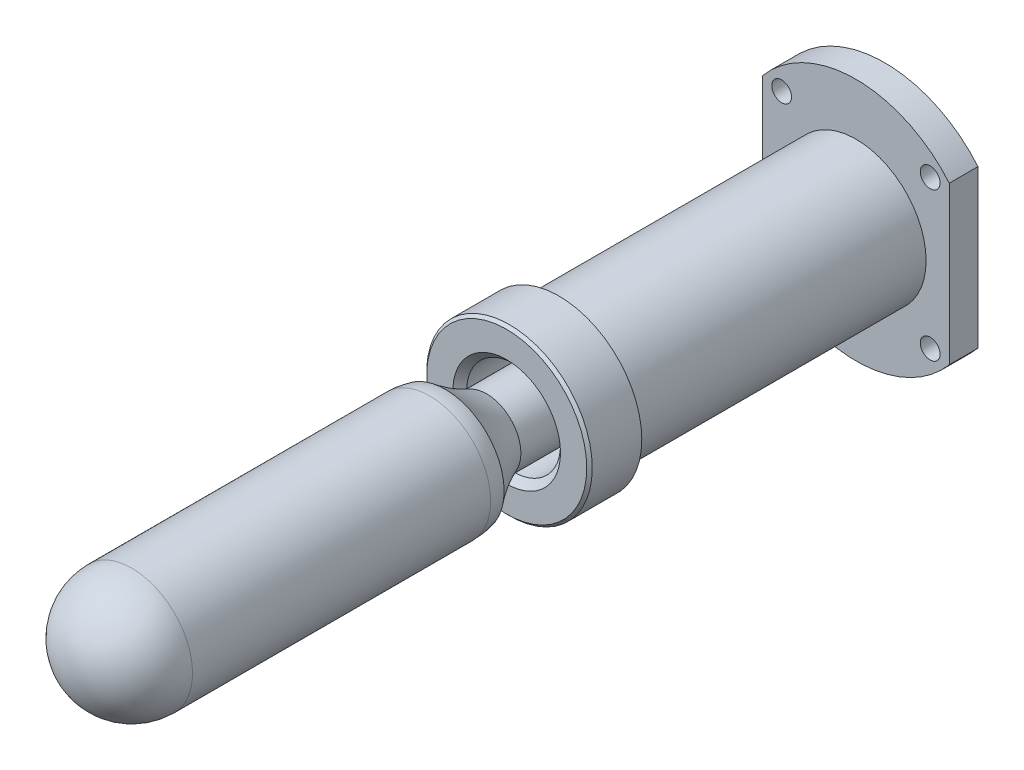
ISO-10303-21;
HEADER;
FILE_DESCRIPTION(('STEP AP214'),'2;1');
FILE_NAME('part.step','',(''),(''),'','','');
FILE_SCHEMA(('AUTOMOTIVE_DESIGN { 1 0 10303 214 1 1 1 1 }'));
ENDSEC;
DATA;
#1=APPLICATION_CONTEXT('core data for automotive mechanical design processes');
#2=APPLICATION_PROTOCOL_DEFINITION('international standard','automotive_design',2000,#1);
#3=PRODUCT_CONTEXT('',#1,'mechanical');
#4=PRODUCT('Part','Part','',(#3));
#5=PRODUCT_RELATED_PRODUCT_CATEGORY('part','',(#4));
#6=PRODUCT_DEFINITION_FORMATION('','',#4);
#7=PRODUCT_DEFINITION_CONTEXT('part definition',#1,'design');
#8=PRODUCT_DEFINITION('design','',#6,#7);
#9=PRODUCT_DEFINITION_SHAPE('','',#8);
#10=(LENGTH_UNIT() NAMED_UNIT(*) SI_UNIT(.MILLI.,.METRE.));
#11=(NAMED_UNIT(*) PLANE_ANGLE_UNIT() SI_UNIT($,.RADIAN.));
#12=(NAMED_UNIT(*) SI_UNIT($,.STERADIAN.) SOLID_ANGLE_UNIT());
#13=UNCERTAINTY_MEASURE_WITH_UNIT(LENGTH_MEASURE(1.E-05),#10,'distance_accuracy_value','');
#14=(GEOMETRIC_REPRESENTATION_CONTEXT(3) GLOBAL_UNCERTAINTY_ASSIGNED_CONTEXT((#13)) GLOBAL_UNIT_ASSIGNED_CONTEXT((#10,
#11,#12)) REPRESENTATION_CONTEXT('',''));
#15=CARTESIAN_POINT('',(0.,0.,0.));
#16=DIRECTION('',(0.,0.,1.));
#17=DIRECTION('',(1.,0.,0.));
#18=AXIS2_PLACEMENT_3D('',#15,#16,#17);
#19=CARTESIAN_POINT('',(-23.9,0.,61.0762435632128));
#20=DIRECTION('',(0.,0.,-1.));
#21=DIRECTION('',(-1.,0.,0.));
#22=AXIS2_PLACEMENT_3D('',#19,#20,#21);
#23=TOROIDAL_SURFACE('',#22,4.22247973708559,2.00000000000001);
#24=CARTESIAN_POINT('',(-23.9,0.,61.0762435632128));
#25=DIRECTION('',(0.,0.,-1.));
#26=DIRECTION('',(-1.,0.,0.));
#27=AXIS2_PLACEMENT_3D('',#24,#25,#26);
#28=CIRCLE('',#27,6.2224797370856);
#29=CARTESIAN_POINT('',(-30.1224797370856,0.,61.0762435632128));
#30=VERTEX_POINT('',#29);
#31=EDGE_CURVE('E131',#30,#30,#28,.T.);
#32=ORIENTED_EDGE('',*,*,#31,.T.);
#33=EDGE_LOOP('',(#32));
#34=FACE_BOUND('',#33,.T.);
#35=CARTESIAN_POINT('',(-23.9,0.,59.0762435632128));
#36=DIRECTION('',(0.,0.,-1.));
#37=DIRECTION('',(-1.,0.,0.));
#38=AXIS2_PLACEMENT_3D('',#35,#36,#37);
#39=CIRCLE('',#38,4.22247973708559);
#40=CARTESIAN_POINT('',(-28.1224797370856,0.,59.0762435632128));
#41=VERTEX_POINT('',#40);
#42=EDGE_CURVE('E12',#41,#41,#39,.T.);
#43=ORIENTED_EDGE('',*,*,#42,.F.);
#44=EDGE_LOOP('',(#43));
#45=FACE_BOUND('',#44,.T.);
#46=ADVANCED_FACE('F109',(#34,#45),#23,.T.);
#47=CARTESIAN_POINT('',(-28.1224797370856,0.,59.0762435632128));
#48=DIRECTION('',(0.,0.,-1.));
#49=DIRECTION('',(-1.,0.,0.));
#50=AXIS2_PLACEMENT_3D('',#47,#48,#49);
#51=PLANE('',#50);
#52=ORIENTED_EDGE('',*,*,#42,.T.);
#53=EDGE_LOOP('',(#52));
#54=FACE_BOUND('',#53,.T.);
#55=ADVANCED_FACE('F156',(#54),#51,.T.);
#56=CARTESIAN_POINT('',(-23.9,0.,136.377543419898));
#57=DIRECTION('',(0.,0.,-1.));
#58=DIRECTION('',(-1.,0.,0.));
#59=AXIS2_PLACEMENT_3D('',#56,#57,#58);
#60=SPHERICAL_SURFACE('',#59,11.);
#61=CARTESIAN_POINT('',(-23.9,0.,136.377543419898));
#62=DIRECTION('',(0.,0.,-1.));
#63=DIRECTION('',(-1.,0.,0.));
#64=AXIS2_PLACEMENT_3D('',#61,#62,#63);
#65=CIRCLE('',#64,11.);
#66=CARTESIAN_POINT('',(-34.9,0.,136.377543419898));
#67=VERTEX_POINT('',#66);
#68=EDGE_CURVE('E115',#67,#67,#65,.T.);
#69=ORIENTED_EDGE('',*,*,#68,.F.);
#70=EDGE_LOOP('',(#69));
#71=FACE_BOUND('',#70,.T.);
#72=ADVANCED_FACE('F154',(#71),#60,.T.);
#73=CARTESIAN_POINT('',(-23.9,0.,59.0762435632128));
#74=DIRECTION('',(0.,0.,-1.));
#75=DIRECTION('',(-1.,0.,0.));
#76=AXIS2_PLACEMENT_3D('',#73,#74,#75);
#77=CYLINDRICAL_SURFACE('',#76,11.);
#78=ORIENTED_EDGE('',*,*,#68,.T.);
#79=EDGE_LOOP('',(#78));
#80=FACE_BOUND('',#79,.T.);
#81=CARTESIAN_POINT('',(-23.9,0.,82.3775434198977));
#82=DIRECTION('',(0.,0.,-1.));
#83=DIRECTION('',(-1.,0.,0.));
#84=AXIS2_PLACEMENT_3D('',#81,#82,#83);
#85=CIRCLE('',#84,11.);
#86=CARTESIAN_POINT('',(-34.9,0.,82.3775434198977));
#87=VERTEX_POINT('',#86);
#88=EDGE_CURVE('E119',#87,#87,#85,.T.);
#89=ORIENTED_EDGE('',*,*,#88,.F.);
#90=EDGE_LOOP('',(#89));
#91=FACE_BOUND('',#90,.T.);
#92=ADVANCED_FACE('F150',(#80,#91),#77,.T.);
#93=CARTESIAN_POINT('',(-23.9,0.,82.3775434198977));
#94=DIRECTION('',(0.,0.,-1.));
#95=DIRECTION('',(-1.,0.,0.));
#96=AXIS2_PLACEMENT_3D('',#93,#94,#95);
#97=SPHERICAL_SURFACE('',#96,11.);
#98=ORIENTED_EDGE('',*,*,#88,.T.);
#99=EDGE_LOOP('',(#98));
#100=FACE_BOUND('',#99,.T.);
#101=CARTESIAN_POINT('',(-23.9,0.,79.5762435632129));
#102=DIRECTION('',(0.,0.,-1.));
#103=DIRECTION('',(-1.,0.,0.));
#104=AXIS2_PLACEMENT_3D('',#101,#102,#103);
#105=CIRCLE('',#104,10.6373266901481);
#106=CARTESIAN_POINT('',(-34.5373266901481,0.,79.5762435632129));
#107=VERTEX_POINT('',#106);
#108=EDGE_CURVE('E123',#107,#107,#105,.T.);
#109=ORIENTED_EDGE('',*,*,#108,.F.);
#110=EDGE_LOOP('',(#109));
#111=FACE_BOUND('',#110,.T.);
#112=ADVANCED_FACE('F146',(#100,#111),#97,.T.);
#113=CARTESIAN_POINT('',(-30.1224797370856,0.,72.1224314730056));
#114=CARTESIAN_POINT('',(-31.7959778925157,0.,76.1482283671684));
#115=CARTESIAN_POINT('',(-34.5373266901481,0.,79.5762435632129));
#116=B_SPLINE_CURVE_WITH_KNOTS('',2,(#113,#114,#115),.UNSPECIFIED.,.F.,.F.,(3,3),(0.,1.),.UNSPECIFIED.);
#117=CARTESIAN_POINT('',(-23.9,0.,59.0762435632128));
#118=DIRECTION('',(0.,0.,-1.));
#119=AXIS1_PLACEMENT('',#117,#118);
#120=SURFACE_OF_REVOLUTION('',#116,#119);
#121=ORIENTED_EDGE('',*,*,#108,.T.);
#122=EDGE_LOOP('',(#121));
#123=FACE_BOUND('',#122,.T.);
#124=CARTESIAN_POINT('',(-23.9,0.,72.1224314730056));
#125=DIRECTION('',(0.,0.,-1.));
#126=DIRECTION('',(-1.,0.,0.));
#127=AXIS2_PLACEMENT_3D('',#124,#125,#126);
#128=CIRCLE('',#127,6.2224797370856);
#129=CARTESIAN_POINT('',(-30.1224797370856,0.,72.1224314730056));
#130=VERTEX_POINT('',#129);
#131=EDGE_CURVE('E128',#130,#130,#128,.T.);
#132=ORIENTED_EDGE('',*,*,#131,.F.);
#133=EDGE_LOOP('',(#132));
#134=FACE_BOUND('',#133,.T.);
#135=ADVANCED_FACE('F141',(#123,#134),#120,.F.);
#136=CARTESIAN_POINT('',(-23.9,0.,59.0762435632128));
#137=DIRECTION('',(0.,0.,-1.));
#138=DIRECTION('',(-1.,0.,0.));
#139=AXIS2_PLACEMENT_3D('',#136,#137,#138);
#140=CYLINDRICAL_SURFACE('',#139,6.2224797370856);
#141=ORIENTED_EDGE('',*,*,#131,.T.);
#142=EDGE_LOOP('',(#141));
#143=FACE_BOUND('',#142,.T.);
#144=ORIENTED_EDGE('',*,*,#31,.F.);
#145=EDGE_LOOP('',(#144));
#146=FACE_BOUND('',#145,.T.);
#147=ADVANCED_FACE('F145',(#143,#146),#140,.T.);
#148=CLOSED_SHELL('',(#46,#55,#72,#92,#112,#135,#147));
#149=MANIFOLD_SOLID_BREP('B2',#148);
#150=CARTESIAN_POINT('',(0.,0.,5.2));
#151=DIRECTION('',(0.,0.,1.));
#152=DIRECTION('',(1.,0.,0.));
#153=AXIS2_PLACEMENT_3D('',#150,#151,#152);
#154=PLANE('',#153);
#155=CARTESIAN_POINT('',(-23.9,0.,5.2));
#156=DIRECTION('',(0.,0.,1.));
#157=DIRECTION('',(1.,0.,0.));
#158=AXIS2_PLACEMENT_3D('',#155,#156,#157);
#159=CIRCLE('',#158,5.15);
#160=CARTESIAN_POINT('',(-18.75,0.,5.2));
#161=VERTEX_POINT('',#160);
#162=EDGE_CURVE('E291',#161,#161,#159,.T.);
#163=ORIENTED_EDGE('',*,*,#162,.F.);
#164=EDGE_LOOP('',(#163));
#165=FACE_BOUND('',#164,.T.);
#166=CARTESIAN_POINT('',(-23.9,0.,5.2));
#167=DIRECTION('',(0.,0.,1.));
#168=DIRECTION('',(1.,0.,0.));
#169=AXIS2_PLACEMENT_3D('',#166,#167,#168);
#170=CIRCLE('',#169,8.7);
#171=CARTESIAN_POINT('',(-15.2,0.,5.2));
#172=VERTEX_POINT('',#171);
#173=EDGE_CURVE('E304',#172,#172,#170,.T.);
#174=ORIENTED_EDGE('',*,*,#173,.T.);
#175=EDGE_LOOP('',(#174));
#176=FACE_BOUND('',#175,.T.);
#177=ADVANCED_FACE('F217',(#165,#176),#154,.T.);
#178=CARTESIAN_POINT('',(-7.,0.,5.2));
#179=DIRECTION('',(-1.,0.,0.));
#180=DIRECTION('',(0.,0.,1.));
#181=AXIS2_PLACEMENT_3D('',#178,#179,#180);
#182=PLANE('',#181);
#183=DIRECTION('',(0.,1.,0.));
#184=VECTOR('',#183,1.);
#185=CARTESIAN_POINT('',(-7.,0.,0.));
#186=LINE('',#185,#184);
#187=CARTESIAN_POINT('',(-7.,-14.2407864951343,0.));
#188=VERTEX_POINT('',#187);
#189=CARTESIAN_POINT('',(-7.,14.2407864951343,0.));
#190=VERTEX_POINT('',#189);
#191=EDGE_CURVE('E301',#188,#190,#186,.T.);
#192=ORIENTED_EDGE('',*,*,#191,.T.);
#193=DIRECTION('',(0.,0.,-1.));
#194=VECTOR('',#193,1.);
#195=CARTESIAN_POINT('',(-7.,14.2407864951343,5.2));
#196=LINE('',#195,#194);
#197=CARTESIAN_POINT('',(-7.,14.2407864951343,5.2));
#198=VERTEX_POINT('',#197);
#199=EDGE_CURVE('E278',#198,#190,#196,.T.);
#200=ORIENTED_EDGE('',*,*,#199,.F.);
#201=DIRECTION('',(0.,1.,0.));
#202=VECTOR('',#201,1.);
#203=CARTESIAN_POINT('',(-7.,0.,5.2));
#204=LINE('',#203,#202);
#205=CARTESIAN_POINT('',(-7.,-14.2407864951343,5.2));
#206=VERTEX_POINT('',#205);
#207=EDGE_CURVE('E268',#206,#198,#204,.T.);
#208=ORIENTED_EDGE('',*,*,#207,.F.);
#209=DIRECTION('',(0.,0.,-1.));
#210=VECTOR('',#209,1.);
#211=CARTESIAN_POINT('',(-7.,-14.2407864951343,5.2));
#212=LINE('',#211,#210);
#213=EDGE_CURVE('E300',#206,#188,#212,.T.);
#214=ORIENTED_EDGE('',*,*,#213,.T.);
#215=EDGE_LOOP('',(#192,#200,#208,#214));
#216=FACE_BOUND('',#215,.T.);
#217=ADVANCED_FACE('F351',(#216),#182,.F.);
#218=CARTESIAN_POINT('',(-23.9,0.,5.2));
#219=DIRECTION('',(0.,0.,-1.));
#220=DIRECTION('',(-1.,0.,0.));
#221=AXIS2_PLACEMENT_3D('',#218,#219,#220);
#222=CYLINDRICAL_SURFACE('',#221,22.1);
#223=CARTESIAN_POINT('',(-23.9,0.,0.));
#224=DIRECTION('',(0.,0.,1.));
#225=DIRECTION('',(1.,0.,0.));
#226=AXIS2_PLACEMENT_3D('',#223,#224,#225);
#227=CIRCLE('',#226,22.1);
#228=CARTESIAN_POINT('',(-40.8,14.2407864951343,0.));
#229=VERTEX_POINT('',#228);
#230=EDGE_CURVE('E274',#190,#229,#227,.T.);
#231=ORIENTED_EDGE('',*,*,#230,.T.);
#232=DIRECTION('',(0.,0.,-1.));
#233=VECTOR('',#232,1.);
#234=CARTESIAN_POINT('',(-40.8,14.2407864951343,5.2));
#235=LINE('',#234,#233);
#236=CARTESIAN_POINT('',(-40.8,14.2407864951343,5.2));
#237=VERTEX_POINT('',#236);
#238=EDGE_CURVE('E272',#237,#229,#235,.T.);
#239=ORIENTED_EDGE('',*,*,#238,.F.);
#240=CARTESIAN_POINT('',(-23.9,0.,5.2));
#241=DIRECTION('',(0.,0.,1.));
#242=DIRECTION('',(1.,0.,0.));
#243=AXIS2_PLACEMENT_3D('',#240,#241,#242);
#244=CIRCLE('',#243,22.1);
#245=EDGE_CURVE('E262',#198,#237,#244,.T.);
#246=ORIENTED_EDGE('',*,*,#245,.F.);
#247=ORIENTED_EDGE('',*,*,#199,.T.);
#248=EDGE_LOOP('',(#231,#239,#246,#247));
#249=FACE_BOUND('',#248,.T.);
#250=ADVANCED_FACE('F273',(#249),#222,.T.);
#251=CARTESIAN_POINT('',(-40.8,0.,5.2));
#252=DIRECTION('',(-1.,0.,0.));
#253=DIRECTION('',(0.,-1.,0.));
#254=AXIS2_PLACEMENT_3D('',#251,#252,#253);
#255=PLANE('',#254);
#256=DIRECTION('',(0.,1.,0.));
#257=VECTOR('',#256,1.);
#258=CARTESIAN_POINT('',(-40.8,0.,0.));
#259=LINE('',#258,#257);
#260=CARTESIAN_POINT('',(-40.8,-14.2407864951343,0.));
#261=VERTEX_POINT('',#260);
#262=EDGE_CURVE('E306',#261,#229,#259,.T.);
#263=ORIENTED_EDGE('',*,*,#262,.F.);
#264=DIRECTION('',(0.,0.,-1.));
#265=VECTOR('',#264,1.);
#266=CARTESIAN_POINT('',(-40.8,-14.2407864951343,5.2));
#267=LINE('',#266,#265);
#268=CARTESIAN_POINT('',(-40.8,-14.2407864951343,5.2));
#269=VERTEX_POINT('',#268);
#270=EDGE_CURVE('E251',#269,#261,#267,.T.);
#271=ORIENTED_EDGE('',*,*,#270,.F.);
#272=DIRECTION('',(0.,1.,0.));
#273=VECTOR('',#272,1.);
#274=CARTESIAN_POINT('',(-40.8,0.,5.2));
#275=LINE('',#274,#273);
#276=EDGE_CURVE('E266',#269,#237,#275,.T.);
#277=ORIENTED_EDGE('',*,*,#276,.T.);
#278=ORIENTED_EDGE('',*,*,#238,.T.);
#279=EDGE_LOOP('',(#263,#271,#277,#278));
#280=FACE_BOUND('',#279,.T.);
#281=ADVANCED_FACE('F280',(#280),#255,.T.);
#282=CARTESIAN_POINT('',(-37.3703841816038,13.4703841816037,5.2));
#283=DIRECTION('',(0.,0.,-1.));
#284=DIRECTION('',(-1.,0.,0.));
#285=AXIS2_PLACEMENT_3D('',#282,#283,#284);
#286=CYLINDRICAL_SURFACE('',#285,1.79);
#287=CARTESIAN_POINT('',(-37.3703841816038,13.4703841816037,5.2));
#288=DIRECTION('',(0.,0.,1.));
#289=DIRECTION('',(1.,0.,0.));
#290=AXIS2_PLACEMENT_3D('',#287,#288,#289);
#291=CIRCLE('',#290,1.79);
#292=CARTESIAN_POINT('',(-35.5803841816038,13.4703841816037,5.2));
#293=VERTEX_POINT('',#292);
#294=EDGE_CURVE('E294',#293,#293,#291,.T.);
#295=ORIENTED_EDGE('',*,*,#294,.T.);
#296=EDGE_LOOP('',(#295));
#297=FACE_BOUND('',#296,.T.);
#298=CARTESIAN_POINT('',(-37.3703841816038,13.4703841816037,0.));
#299=DIRECTION('',(0.,0.,1.));
#300=DIRECTION('',(1.,0.,0.));
#301=AXIS2_PLACEMENT_3D('',#298,#299,#300);
#302=CIRCLE('',#301,1.79);
#303=CARTESIAN_POINT('',(-35.5803841816038,13.4703841816037,0.));
#304=VERTEX_POINT('',#303);
#305=EDGE_CURVE('E318',#304,#304,#302,.T.);
#306=ORIENTED_EDGE('',*,*,#305,.F.);
#307=EDGE_LOOP('',(#306));
#308=FACE_BOUND('',#307,.T.);
#309=ADVANCED_FACE('F766',(#297,#308),#286,.F.);
#310=CARTESIAN_POINT('',(-23.9,0.,5.2));
#311=DIRECTION('',(0.,0.,-1.));
#312=DIRECTION('',(-1.,0.,0.));
#313=AXIS2_PLACEMENT_3D('',#310,#311,#312);
#314=CYLINDRICAL_SURFACE('',#313,5.15);
#315=ORIENTED_EDGE('',*,*,#162,.T.);
#316=EDGE_LOOP('',(#315));
#317=FACE_BOUND('',#316,.T.);
#318=CARTESIAN_POINT('',(-23.9,0.,0.));
#319=DIRECTION('',(0.,0.,1.));
#320=DIRECTION('',(1.,0.,0.));
#321=AXIS2_PLACEMENT_3D('',#318,#319,#320);
#322=CIRCLE('',#321,5.15);
#323=CARTESIAN_POINT('',(-18.75,0.,0.));
#324=VERTEX_POINT('',#323);
#325=EDGE_CURVE('E315',#324,#324,#322,.T.);
#326=ORIENTED_EDGE('',*,*,#325,.F.);
#327=EDGE_LOOP('',(#326));
#328=FACE_BOUND('',#327,.T.);
#329=ADVANCED_FACE('F757',(#317,#328),#314,.F.);
#330=CARTESIAN_POINT('',(-10.4649711574556,-13.4350288425444,5.2));
#331=DIRECTION('',(0.,0.,-1.));
#332=DIRECTION('',(-1.,0.,0.));
#333=AXIS2_PLACEMENT_3D('',#330,#331,#332);
#334=CYLINDRICAL_SURFACE('',#333,1.79);
#335=CARTESIAN_POINT('',(-10.4649711574556,-13.4350288425444,5.2));
#336=DIRECTION('',(0.,0.,1.));
#337=DIRECTION('',(1.,0.,0.));
#338=AXIS2_PLACEMENT_3D('',#335,#336,#337);
#339=CIRCLE('',#338,1.79);
#340=CARTESIAN_POINT('',(-8.67497115745562,-13.4350288425444,5.2));
#341=VERTEX_POINT('',#340);
#342=EDGE_CURVE('E288',#341,#341,#339,.F.);
#343=ORIENTED_EDGE('',*,*,#342,.F.);
#344=EDGE_LOOP('',(#343));
#345=FACE_BOUND('',#344,.T.);
#346=CARTESIAN_POINT('',(-10.4649711574556,-13.4350288425444,0.));
#347=DIRECTION('',(0.,0.,1.));
#348=DIRECTION('',(1.,0.,0.));
#349=AXIS2_PLACEMENT_3D('',#346,#347,#348);
#350=CIRCLE('',#349,1.79);
#351=CARTESIAN_POINT('',(-8.67497115745562,-13.4350288425444,0.));
#352=VERTEX_POINT('',#351);
#353=EDGE_CURVE('E312',#352,#352,#350,.F.);
#354=ORIENTED_EDGE('',*,*,#353,.T.);
#355=EDGE_LOOP('',(#354));
#356=FACE_BOUND('',#355,.T.);
#357=ADVANCED_FACE('F748',(#345,#356),#334,.F.);
#358=CARTESIAN_POINT('',(-37.3703841816038,-13.4703841816037,5.2));
#359=DIRECTION('',(0.,0.,-1.));
#360=DIRECTION('',(-1.,0.,0.));
#361=AXIS2_PLACEMENT_3D('',#358,#359,#360);
#362=CYLINDRICAL_SURFACE('',#361,1.79);
#363=CARTESIAN_POINT('',(-37.3703841816038,-13.4703841816037,5.2));
#364=DIRECTION('',(0.,0.,1.));
#365=DIRECTION('',(1.,0.,0.));
#366=AXIS2_PLACEMENT_3D('',#363,#364,#365);
#367=CIRCLE('',#366,1.79);
#368=CARTESIAN_POINT('',(-35.5803841816038,-13.4703841816037,5.2));
#369=VERTEX_POINT('',#368);
#370=EDGE_CURVE('E282',#369,#369,#367,.F.);
#371=ORIENTED_EDGE('',*,*,#370,.F.);
#372=EDGE_LOOP('',(#371));
#373=FACE_BOUND('',#372,.T.);
#374=CARTESIAN_POINT('',(-37.3703841816038,-13.4703841816037,0.));
#375=DIRECTION('',(0.,0.,1.));
#376=DIRECTION('',(1.,0.,0.));
#377=AXIS2_PLACEMENT_3D('',#374,#375,#376);
#378=CIRCLE('',#377,1.79);
#379=CARTESIAN_POINT('',(-35.5803841816038,-13.4703841816037,0.));
#380=VERTEX_POINT('',#379);
#381=EDGE_CURVE('E309',#380,#380,#378,.F.);
#382=ORIENTED_EDGE('',*,*,#381,.T.);
#383=EDGE_LOOP('',(#382));
#384=FACE_BOUND('',#383,.T.);
#385=ADVANCED_FACE('F740',(#373,#384),#362,.F.);
#386=CARTESIAN_POINT('',(-23.9,0.,5.2));
#387=DIRECTION('',(0.,0.,-1.));
#388=DIRECTION('',(-1.,0.,0.));
#389=AXIS2_PLACEMENT_3D('',#386,#387,#388);
#390=CYLINDRICAL_SURFACE('',#389,22.1);
#391=CARTESIAN_POINT('',(-23.9,0.,0.));
#392=DIRECTION('',(0.,0.,1.));
#393=DIRECTION('',(1.,0.,0.));
#394=AXIS2_PLACEMENT_3D('',#391,#392,#393);
#395=CIRCLE('',#394,22.1);
#396=EDGE_CURVE('E254',#261,#188,#395,.T.);
#397=ORIENTED_EDGE('',*,*,#396,.T.);
#398=ORIENTED_EDGE('',*,*,#213,.F.);
#399=CARTESIAN_POINT('',(-23.9,0.,5.2));
#400=DIRECTION('',(0.,0.,1.));
#401=DIRECTION('',(1.,0.,0.));
#402=AXIS2_PLACEMENT_3D('',#399,#400,#401);
#403=CIRCLE('',#402,22.1);
#404=EDGE_CURVE('E235',#269,#206,#403,.T.);
#405=ORIENTED_EDGE('',*,*,#404,.F.);
#406=ORIENTED_EDGE('',*,*,#270,.T.);
#407=EDGE_LOOP('',(#397,#398,#405,#406));
#408=FACE_BOUND('',#407,.T.);
#409=ADVANCED_FACE('F374',(#408),#390,.T.);
#410=CARTESIAN_POINT('',(-10.4649711574556,13.4350288425444,5.2));
#411=DIRECTION('',(0.,0.,-1.));
#412=DIRECTION('',(-1.,0.,0.));
#413=AXIS2_PLACEMENT_3D('',#410,#411,#412);
#414=CYLINDRICAL_SURFACE('',#413,1.79);
#415=CARTESIAN_POINT('',(-10.4649711574556,13.4350288425444,5.2));
#416=DIRECTION('',(0.,0.,1.));
#417=DIRECTION('',(1.,0.,0.));
#418=AXIS2_PLACEMENT_3D('',#415,#416,#417);
#419=CIRCLE('',#418,1.79);
#420=CARTESIAN_POINT('',(-8.67497115745562,13.4350288425444,5.2));
#421=VERTEX_POINT('',#420);
#422=EDGE_CURVE('E297',#421,#421,#419,.T.);
#423=ORIENTED_EDGE('',*,*,#422,.T.);
#424=EDGE_LOOP('',(#423));
#425=FACE_BOUND('',#424,.T.);
#426=CARTESIAN_POINT('',(-10.4649711574556,13.4350288425444,0.));
#427=DIRECTION('',(0.,0.,1.));
#428=DIRECTION('',(1.,0.,0.));
#429=AXIS2_PLACEMENT_3D('',#426,#427,#428);
#430=CIRCLE('',#429,1.79);
#431=CARTESIAN_POINT('',(-8.67497115745562,13.4350288425444,0.));
#432=VERTEX_POINT('',#431);
#433=EDGE_CURVE('E321',#432,#432,#430,.T.);
#434=ORIENTED_EDGE('',*,*,#433,.F.);
#435=EDGE_LOOP('',(#434));
#436=FACE_BOUND('',#435,.T.);
#437=ADVANCED_FACE('F366',(#425,#436),#414,.F.);
#438=CARTESIAN_POINT('',(-23.9,0.,5.2));
#439=DIRECTION('',(0.,0.,1.));
#440=DIRECTION('',(1.,0.,0.));
#441=AXIS2_PLACEMENT_3D('',#438,#439,#440);
#442=CIRCLE('',#441,12.7);
#443=CARTESIAN_POINT('',(-11.2,0.,5.2));
#444=VERTEX_POINT('',#443);
#445=EDGE_CURVE('E327',#444,#444,#442,.T.);
#446=ORIENTED_EDGE('',*,*,#445,.F.);
#447=EDGE_LOOP('',(#446));
#448=FACE_BOUND('',#447,.T.);
#449=ORIENTED_EDGE('',*,*,#207,.T.);
#450=ORIENTED_EDGE('',*,*,#245,.T.);
#451=ORIENTED_EDGE('',*,*,#276,.F.);
#452=ORIENTED_EDGE('',*,*,#404,.T.);
#453=EDGE_LOOP('',(#449,#450,#451,#452));
#454=FACE_BOUND('',#453,.T.);
#455=ORIENTED_EDGE('',*,*,#370,.T.);
#456=EDGE_LOOP('',(#455));
#457=FACE_BOUND('',#456,.T.);
#458=ORIENTED_EDGE('',*,*,#342,.T.);
#459=EDGE_LOOP('',(#458));
#460=FACE_BOUND('',#459,.T.);
#461=ORIENTED_EDGE('',*,*,#294,.F.);
#462=EDGE_LOOP('',(#461));
#463=FACE_BOUND('',#462,.T.);
#464=ORIENTED_EDGE('',*,*,#422,.F.);
#465=EDGE_LOOP('',(#464));
#466=FACE_BOUND('',#465,.T.);
#467=ADVANCED_FACE('F263',(#448,#454,#457,#460,#463,#466),#154,.T.);
#468=CARTESIAN_POINT('',(0.,0.,0.));
#469=DIRECTION('',(0.,0.,1.));
#470=DIRECTION('',(1.,0.,0.));
#471=AXIS2_PLACEMENT_3D('',#468,#469,#470);
#472=PLANE('',#471);
#473=CARTESIAN_POINT('',(-19.7287505872206,-10.070286904373,0.));
#474=DIRECTION('',(0.,0.,1.));
#475=DIRECTION('',(1.,0.,0.));
#476=AXIS2_PLACEMENT_3D('',#473,#474,#475);
#477=CIRCLE('',#476,1.5);
#478=CARTESIAN_POINT('',(-18.2287505872205,-10.070286904373,0.));
#479=VERTEX_POINT('',#478);
#480=EDGE_CURVE('E406',#479,#479,#477,.T.);
#481=ORIENTED_EDGE('',*,*,#480,.T.);
#482=EDGE_LOOP('',(#481));
#483=FACE_BOUND('',#482,.T.);
#484=CARTESIAN_POINT('',(-28.0712494127795,-10.070286904373,0.));
#485=DIRECTION('',(0.,0.,1.));
#486=DIRECTION('',(1.,0.,0.));
#487=AXIS2_PLACEMENT_3D('',#484,#485,#486);
#488=CIRCLE('',#487,1.49999999999999);
#489=CARTESIAN_POINT('',(-26.5712494127795,-10.070286904373,0.));
#490=VERTEX_POINT('',#489);
#491=EDGE_CURVE('E412',#490,#490,#488,.T.);
#492=ORIENTED_EDGE('',*,*,#491,.T.);
#493=EDGE_LOOP('',(#492));
#494=FACE_BOUND('',#493,.T.);
#495=CARTESIAN_POINT('',(-33.970286904373,-4.17124941277943,0.));
#496=DIRECTION('',(0.,0.,1.));
#497=DIRECTION('',(1.,0.,0.));
#498=AXIS2_PLACEMENT_3D('',#495,#496,#497);
#499=CIRCLE('',#498,1.5);
#500=CARTESIAN_POINT('',(-32.470286904373,-4.17124941277943,0.));
#501=VERTEX_POINT('',#500);
#502=EDGE_CURVE('E418',#501,#501,#499,.T.);
#503=ORIENTED_EDGE('',*,*,#502,.T.);
#504=EDGE_LOOP('',(#503));
#505=FACE_BOUND('',#504,.T.);
#506=CARTESIAN_POINT('',(-33.970286904373,4.17124941277952,0.));
#507=DIRECTION('',(0.,0.,1.));
#508=DIRECTION('',(1.,0.,0.));
#509=AXIS2_PLACEMENT_3D('',#506,#507,#508);
#510=CIRCLE('',#509,1.5);
#511=CARTESIAN_POINT('',(-32.470286904373,4.17124941277952,0.));
#512=VERTEX_POINT('',#511);
#513=EDGE_CURVE('E424',#512,#512,#510,.T.);
#514=ORIENTED_EDGE('',*,*,#513,.T.);
#515=EDGE_LOOP('',(#514));
#516=FACE_BOUND('',#515,.T.);
#517=CARTESIAN_POINT('',(-28.0712494127794,10.070286904373,0.));
#518=DIRECTION('',(0.,0.,1.));
#519=DIRECTION('',(1.,0.,0.));
#520=AXIS2_PLACEMENT_3D('',#517,#518,#519);
#521=CIRCLE('',#520,1.5);
#522=CARTESIAN_POINT('',(-26.5712494127794,10.070286904373,0.));
#523=VERTEX_POINT('',#522);
#524=EDGE_CURVE('E430',#523,#523,#521,.T.);
#525=ORIENTED_EDGE('',*,*,#524,.T.);
#526=EDGE_LOOP('',(#525));
#527=FACE_BOUND('',#526,.T.);
#528=CARTESIAN_POINT('',(-19.7287505872205,10.070286904373,0.));
#529=DIRECTION('',(0.,0.,1.));
#530=DIRECTION('',(1.,0.,0.));
#531=AXIS2_PLACEMENT_3D('',#528,#529,#530);
#532=CIRCLE('',#531,1.5);
#533=CARTESIAN_POINT('',(-18.2287505872205,10.070286904373,0.));
#534=VERTEX_POINT('',#533);
#535=EDGE_CURVE('E436',#534,#534,#532,.T.);
#536=ORIENTED_EDGE('',*,*,#535,.T.);
#537=EDGE_LOOP('',(#536));
#538=FACE_BOUND('',#537,.T.);
#539=CARTESIAN_POINT('',(-13.8297130956269,4.17124941277943,0.));
#540=DIRECTION('',(0.,0.,1.));
#541=DIRECTION('',(1.,0.,0.));
#542=AXIS2_PLACEMENT_3D('',#539,#540,#541);
#543=CIRCLE('',#542,1.5);
#544=CARTESIAN_POINT('',(-12.3297130956269,4.17124941277943,0.));
#545=VERTEX_POINT('',#544);
#546=EDGE_CURVE('E442',#545,#545,#543,.T.);
#547=ORIENTED_EDGE('',*,*,#546,.T.);
#548=EDGE_LOOP('',(#547));
#549=FACE_BOUND('',#548,.T.);
#550=CARTESIAN_POINT('',(-13.829713095627,-4.17124941277952,0.));
#551=DIRECTION('',(0.,0.,1.));
#552=DIRECTION('',(1.,0.,0.));
#553=AXIS2_PLACEMENT_3D('',#550,#551,#552);
#554=CIRCLE('',#553,1.5);
#555=CARTESIAN_POINT('',(-12.329713095627,-4.17124941277952,0.));
#556=VERTEX_POINT('',#555);
#557=EDGE_CURVE('E400',#556,#556,#554,.T.);
#558=ORIENTED_EDGE('',*,*,#557,.T.);
#559=EDGE_LOOP('',(#558));
#560=FACE_BOUND('',#559,.T.);
#561=ORIENTED_EDGE('',*,*,#191,.F.);
#562=ORIENTED_EDGE('',*,*,#396,.F.);
#563=ORIENTED_EDGE('',*,*,#262,.T.);
#564=ORIENTED_EDGE('',*,*,#230,.F.);
#565=EDGE_LOOP('',(#561,#562,#563,#564));
#566=FACE_BOUND('',#565,.T.);
#567=ORIENTED_EDGE('',*,*,#381,.F.);
#568=EDGE_LOOP('',(#567));
#569=FACE_BOUND('',#568,.T.);
#570=ORIENTED_EDGE('',*,*,#353,.F.);
#571=EDGE_LOOP('',(#570));
#572=FACE_BOUND('',#571,.T.);
#573=ORIENTED_EDGE('',*,*,#305,.T.);
#574=EDGE_LOOP('',(#573));
#575=FACE_BOUND('',#574,.T.);
#576=ORIENTED_EDGE('',*,*,#433,.T.);
#577=EDGE_LOOP('',(#576));
#578=FACE_BOUND('',#577,.T.);
#579=ORIENTED_EDGE('',*,*,#325,.T.);
#580=EDGE_LOOP('',(#579));
#581=FACE_BOUND('',#580,.T.);
#582=ADVANCED_FACE('F365',(#483,#494,#505,#516,#527,#538,#549,#560,#566,#569,#572,#575,#578,
#581),#472,.F.);
#583=CARTESIAN_POINT('',(-23.9,0.,59.));
#584=DIRECTION('',(0.,0.,-1.));
#585=DIRECTION('',(-1.,0.,0.));
#586=AXIS2_PLACEMENT_3D('',#583,#584,#585);
#587=CYLINDRICAL_SURFACE('',#586,8.7);
#588=ORIENTED_EDGE('',*,*,#173,.F.);
#589=EDGE_LOOP('',(#588));
#590=FACE_BOUND('',#589,.T.);
#591=CARTESIAN_POINT('',(-23.9,0.,59.));
#592=DIRECTION('',(0.,0.,1.));
#593=DIRECTION('',(1.,0.,0.));
#594=AXIS2_PLACEMENT_3D('',#591,#592,#593);
#595=CIRCLE('',#594,8.7);
#596=CARTESIAN_POINT('',(-15.2,0.,59.));
#597=VERTEX_POINT('',#596);
#598=EDGE_CURVE('E386',#597,#597,#595,.F.);
#599=ORIENTED_EDGE('',*,*,#598,.F.);
#600=EDGE_LOOP('',(#599));
#601=FACE_BOUND('',#600,.T.);
#602=ADVANCED_FACE('F372',(#590,#601),#587,.F.);
#603=CARTESIAN_POINT('',(-23.9,0.,59.));
#604=DIRECTION('',(0.,0.,-1.));
#605=DIRECTION('',(-1.,0.,0.));
#606=AXIS2_PLACEMENT_3D('',#603,#604,#605);
#607=CYLINDRICAL_SURFACE('',#606,12.7);
#608=ORIENTED_EDGE('',*,*,#445,.T.);
#609=EDGE_LOOP('',(#608));
#610=FACE_BOUND('',#609,.T.);
#611=CARTESIAN_POINT('',(-23.9,0.,59.));
#612=DIRECTION('',(0.,0.,1.));
#613=DIRECTION('',(1.,0.,0.));
#614=AXIS2_PLACEMENT_3D('',#611,#612,#613);
#615=CIRCLE('',#614,12.7);
#616=CARTESIAN_POINT('',(-11.2,0.,59.));
#617=VERTEX_POINT('',#616);
#618=EDGE_CURVE('E383',#617,#617,#615,.F.);
#619=ORIENTED_EDGE('',*,*,#618,.T.);
#620=EDGE_LOOP('',(#619));
#621=FACE_BOUND('',#620,.T.);
#622=ADVANCED_FACE('F526',(#610,#621),#607,.T.);
#623=CARTESIAN_POINT('',(-23.9,0.,59.));
#624=DIRECTION('',(0.,0.,1.));
#625=DIRECTION('',(1.,0.,0.));
#626=AXIS2_PLACEMENT_3D('',#623,#624,#625);
#627=PLANE('',#626);
#628=CARTESIAN_POINT('',(-23.9,0.,59.));
#629=DIRECTION('',(0.,0.,1.));
#630=DIRECTION('',(1.,0.,0.));
#631=AXIS2_PLACEMENT_3D('',#628,#629,#630);
#632=CIRCLE('',#631,8.5);
#633=CARTESIAN_POINT('',(-15.4,0.,59.));
#634=VERTEX_POINT('',#633);
#635=EDGE_CURVE('E396',#634,#634,#632,.T.);
#636=ORIENTED_EDGE('',*,*,#635,.T.);
#637=EDGE_LOOP('',(#636));
#638=FACE_BOUND('',#637,.T.);
#639=ORIENTED_EDGE('',*,*,#598,.T.);
#640=EDGE_LOOP('',(#639));
#641=FACE_BOUND('',#640,.T.);
#642=ADVANCED_FACE('F518',(#638,#641),#627,.F.);
#643=CARTESIAN_POINT('',(-23.9,0.,68.47));
#644=DIRECTION('',(0.,0.,1.));
#645=DIRECTION('',(1.,0.,0.));
#646=AXIS2_PLACEMENT_3D('',#643,#644,#645);
#647=PLANE('',#646);
#648=CARTESIAN_POINT('',(-23.9,0.,68.47));
#649=DIRECTION('',(0.,0.,1.));
#650=DIRECTION('',(1.,0.,0.));
#651=AXIS2_PLACEMENT_3D('',#648,#649,#650);
#652=CIRCLE('',#651,9.75000000000002);
#653=CARTESIAN_POINT('',(-14.15,0.,68.47));
#654=VERTEX_POINT('',#653);
#655=EDGE_CURVE('E107',#654,#654,#652,.F.);
#656=ORIENTED_EDGE('',*,*,#655,.T.);
#657=EDGE_LOOP('',(#656));
#658=FACE_BOUND('',#657,.T.);
#659=CARTESIAN_POINT('',(-23.9,0.,68.47));
#660=DIRECTION('',(0.,0.,1.));
#661=DIRECTION('',(1.,0.,0.));
#662=AXIS2_PLACEMENT_3D('',#659,#660,#661);
#663=CIRCLE('',#662,14.5);
#664=CARTESIAN_POINT('',(-9.39999999999998,0.,68.47));
#665=VERTEX_POINT('',#664);
#666=EDGE_CURVE('E328',#665,#665,#663,.T.);
#667=ORIENTED_EDGE('',*,*,#666,.T.);
#668=EDGE_LOOP('',(#667));
#669=FACE_BOUND('',#668,.T.);
#670=ADVANCED_FACE('F514',(#658,#669),#647,.T.);
#671=ORIENTED_EDGE('',*,*,#618,.F.);
#672=EDGE_LOOP('',(#671));
#673=FACE_BOUND('',#672,.T.);
#674=CARTESIAN_POINT('',(-23.9,0.,59.));
#675=DIRECTION('',(0.,0.,1.));
#676=DIRECTION('',(1.,0.,0.));
#677=AXIS2_PLACEMENT_3D('',#674,#675,#676);
#678=CIRCLE('',#677,15.);
#679=CARTESIAN_POINT('',(-8.9,0.,59.));
#680=VERTEX_POINT('',#679);
#681=EDGE_CURVE('E392',#680,#680,#678,.T.);
#682=ORIENTED_EDGE('',*,*,#681,.F.);
#683=EDGE_LOOP('',(#682));
#684=FACE_BOUND('',#683,.T.);
#685=ADVANCED_FACE('F517',(#673,#684),#627,.F.);
#686=CARTESIAN_POINT('',(-23.9,0.,68.47));
#687=DIRECTION('',(0.,0.,-1.));
#688=DIRECTION('',(-1.,0.,0.));
#689=AXIS2_PLACEMENT_3D('',#686,#687,#688);
#690=CYLINDRICAL_SURFACE('',#689,15.);
#691=CARTESIAN_POINT('',(-23.9,0.,67.97));
#692=DIRECTION('',(0.,0.,1.));
#693=DIRECTION('',(1.,0.,0.));
#694=AXIS2_PLACEMENT_3D('',#691,#692,#693);
#695=CIRCLE('',#694,15.);
#696=CARTESIAN_POINT('',(-8.9,0.,67.97));
#697=VERTEX_POINT('',#696);
#698=EDGE_CURVE('E331',#697,#697,#695,.F.);
#699=ORIENTED_EDGE('',*,*,#698,.T.);
#700=EDGE_LOOP('',(#699));
#701=FACE_BOUND('',#700,.T.);
#702=ORIENTED_EDGE('',*,*,#681,.T.);
#703=EDGE_LOOP('',(#702));
#704=FACE_BOUND('',#703,.T.);
#705=ADVANCED_FACE('F513',(#701,#704),#690,.T.);
#706=CARTESIAN_POINT('',(-23.9,0.,68.47));
#707=DIRECTION('',(0.,0.,-1.));
#708=DIRECTION('',(-1.,0.,0.));
#709=AXIS2_PLACEMENT_3D('',#706,#707,#708);
#710=CYLINDRICAL_SURFACE('',#709,8.5);
#711=CARTESIAN_POINT('',(-23.9,0.,67.22));
#712=DIRECTION('',(0.,0.,1.));
#713=DIRECTION('',(1.,0.,0.));
#714=AXIS2_PLACEMENT_3D('',#711,#712,#713);
#715=CIRCLE('',#714,8.5);
#716=CARTESIAN_POINT('',(-15.4,0.,67.22));
#717=VERTEX_POINT('',#716);
#718=EDGE_CURVE('E227',#717,#717,#715,.T.);
#719=ORIENTED_EDGE('',*,*,#718,.T.);
#720=EDGE_LOOP('',(#719));
#721=FACE_BOUND('',#720,.T.);
#722=ORIENTED_EDGE('',*,*,#635,.F.);
#723=EDGE_LOOP('',(#722));
#724=FACE_BOUND('',#723,.T.);
#725=ADVANCED_FACE('F336',(#721,#724),#710,.F.);
#726=CARTESIAN_POINT('',(-23.9,0.,68.47));
#727=DIRECTION('',(0.,0.,-1.));
#728=DIRECTION('',(-1.,0.,0.));
#729=AXIS2_PLACEMENT_3D('',#726,#727,#728);
#730=CONICAL_SURFACE('',#729,14.5,0.785398163397421);
#731=ORIENTED_EDGE('',*,*,#698,.F.);
#732=EDGE_LOOP('',(#731));
#733=FACE_BOUND('',#732,.T.);
#734=ORIENTED_EDGE('',*,*,#666,.F.);
#735=EDGE_LOOP('',(#734));
#736=FACE_BOUND('',#735,.T.);
#737=ADVANCED_FACE('F509',(#733,#736),#730,.T.);
#738=CARTESIAN_POINT('',(-13.829713095627,-4.17124941277952,40.));
#739=DIRECTION('',(0.,0.,-1.));
#740=DIRECTION('',(-1.,0.,0.));
#741=AXIS2_PLACEMENT_3D('',#738,#739,#740);
#742=CYLINDRICAL_SURFACE('',#741,1.5);
#743=CARTESIAN_POINT('',(-13.829713095627,-4.17124941277952,40.));
#744=DIRECTION('',(0.,0.,1.));
#745=DIRECTION('',(1.,0.,0.));
#746=AXIS2_PLACEMENT_3D('',#743,#744,#745);
#747=CIRCLE('',#746,1.5);
#748=CARTESIAN_POINT('',(-12.329713095627,-4.17124941277952,40.));
#749=VERTEX_POINT('',#748);
#750=EDGE_CURVE('E399',#749,#749,#747,.T.);
#751=ORIENTED_EDGE('',*,*,#750,.T.);
#752=EDGE_LOOP('',(#751));
#753=FACE_BOUND('',#752,.T.);
#754=ORIENTED_EDGE('',*,*,#557,.F.);
#755=EDGE_LOOP('',(#754));
#756=FACE_BOUND('',#755,.T.);
#757=ADVANCED_FACE('F505',(#753,#756),#742,.F.);
#758=CARTESIAN_POINT('',(0.,0.,40.));
#759=DIRECTION('',(0.,0.,1.));
#760=DIRECTION('',(1.,0.,0.));
#761=AXIS2_PLACEMENT_3D('',#758,#759,#760);
#762=PLANE('',#761);
#763=ORIENTED_EDGE('',*,*,#750,.F.);
#764=EDGE_LOOP('',(#763));
#765=FACE_BOUND('',#764,.T.);
#766=ADVANCED_FACE('F462',(#765),#762,.F.);
#767=CARTESIAN_POINT('',(-13.8297130956269,4.17124941277943,40.));
#768=DIRECTION('',(0.,0.,-1.));
#769=DIRECTION('',(-1.,0.,0.));
#770=AXIS2_PLACEMENT_3D('',#767,#768,#769);
#771=CYLINDRICAL_SURFACE('',#770,1.5);
#772=CARTESIAN_POINT('',(-13.8297130956269,4.17124941277943,40.));
#773=DIRECTION('',(0.,0.,1.));
#774=DIRECTION('',(1.,0.,0.));
#775=AXIS2_PLACEMENT_3D('',#772,#773,#774);
#776=CIRCLE('',#775,1.5);
#777=CARTESIAN_POINT('',(-12.3297130956269,4.17124941277943,40.));
#778=VERTEX_POINT('',#777);
#779=EDGE_CURVE('E403',#778,#778,#776,.T.);
#780=ORIENTED_EDGE('',*,*,#779,.T.);
#781=EDGE_LOOP('',(#780));
#782=FACE_BOUND('',#781,.T.);
#783=ORIENTED_EDGE('',*,*,#546,.F.);
#784=EDGE_LOOP('',(#783));
#785=FACE_BOUND('',#784,.T.);
#786=ADVANCED_FACE('F448',(#782,#785),#771,.F.);
#787=CARTESIAN_POINT('',(0.,0.,40.));
#788=DIRECTION('',(0.,0.,1.));
#789=DIRECTION('',(1.,0.,0.));
#790=AXIS2_PLACEMENT_3D('',#787,#788,#789);
#791=PLANE('',#790);
#792=ORIENTED_EDGE('',*,*,#779,.F.);
#793=EDGE_LOOP('',(#792));
#794=FACE_BOUND('',#793,.T.);
#795=ADVANCED_FACE('F451',(#794),#791,.F.);
#796=CARTESIAN_POINT('',(-19.7287505872205,10.070286904373,40.));
#797=DIRECTION('',(0.,0.,-1.));
#798=DIRECTION('',(-1.,0.,0.));
#799=AXIS2_PLACEMENT_3D('',#796,#797,#798);
#800=CYLINDRICAL_SURFACE('',#799,1.5);
#801=CARTESIAN_POINT('',(-19.7287505872205,10.070286904373,40.));
#802=DIRECTION('',(0.,0.,1.));
#803=DIRECTION('',(1.,0.,0.));
#804=AXIS2_PLACEMENT_3D('',#801,#802,#803);
#805=CIRCLE('',#804,1.5);
#806=CARTESIAN_POINT('',(-18.2287505872205,10.070286904373,40.));
#807=VERTEX_POINT('',#806);
#808=EDGE_CURVE('E439',#807,#807,#805,.T.);
#809=ORIENTED_EDGE('',*,*,#808,.T.);
#810=EDGE_LOOP('',(#809));
#811=FACE_BOUND('',#810,.T.);
#812=ORIENTED_EDGE('',*,*,#535,.F.);
#813=EDGE_LOOP('',(#812));
#814=FACE_BOUND('',#813,.T.);
#815=ADVANCED_FACE('F453',(#811,#814),#800,.F.);
#816=CARTESIAN_POINT('',(0.,0.,40.));
#817=DIRECTION('',(0.,0.,1.));
#818=DIRECTION('',(1.,0.,0.));
#819=AXIS2_PLACEMENT_3D('',#816,#817,#818);
#820=PLANE('',#819);
#821=ORIENTED_EDGE('',*,*,#808,.F.);
#822=EDGE_LOOP('',(#821));
#823=FACE_BOUND('',#822,.T.);
#824=ADVANCED_FACE('F459',(#823),#820,.F.);
#825=CARTESIAN_POINT('',(-28.0712494127794,10.070286904373,40.));
#826=DIRECTION('',(0.,0.,-1.));
#827=DIRECTION('',(-1.,0.,0.));
#828=AXIS2_PLACEMENT_3D('',#825,#826,#827);
#829=CYLINDRICAL_SURFACE('',#828,1.5);
#830=CARTESIAN_POINT('',(-28.0712494127794,10.070286904373,40.));
#831=DIRECTION('',(0.,0.,1.));
#832=DIRECTION('',(1.,0.,0.));
#833=AXIS2_PLACEMENT_3D('',#830,#831,#832);
#834=CIRCLE('',#833,1.5);
#835=CARTESIAN_POINT('',(-26.5712494127794,10.070286904373,40.));
#836=VERTEX_POINT('',#835);
#837=EDGE_CURVE('E433',#836,#836,#834,.T.);
#838=ORIENTED_EDGE('',*,*,#837,.T.);
#839=EDGE_LOOP('',(#838));
#840=FACE_BOUND('',#839,.T.);
#841=ORIENTED_EDGE('',*,*,#524,.F.);
#842=EDGE_LOOP('',(#841));
#843=FACE_BOUND('',#842,.T.);
#844=ADVANCED_FACE('F466',(#840,#843),#829,.F.);
#845=CARTESIAN_POINT('',(0.,0.,40.));
#846=DIRECTION('',(0.,0.,1.));
#847=DIRECTION('',(1.,0.,0.));
#848=AXIS2_PLACEMENT_3D('',#845,#846,#847);
#849=PLANE('',#848);
#850=ORIENTED_EDGE('',*,*,#837,.F.);
#851=EDGE_LOOP('',(#850));
#852=FACE_BOUND('',#851,.T.);
#853=ADVANCED_FACE('F469',(#852),#849,.F.);
#854=CARTESIAN_POINT('',(-33.970286904373,4.17124941277952,40.));
#855=DIRECTION('',(0.,0.,-1.));
#856=DIRECTION('',(-1.,0.,0.));
#857=AXIS2_PLACEMENT_3D('',#854,#855,#856);
#858=CYLINDRICAL_SURFACE('',#857,1.5);
#859=CARTESIAN_POINT('',(-33.970286904373,4.17124941277952,40.));
#860=DIRECTION('',(0.,0.,1.));
#861=DIRECTION('',(1.,0.,0.));
#862=AXIS2_PLACEMENT_3D('',#859,#860,#861);
#863=CIRCLE('',#862,1.5);
#864=CARTESIAN_POINT('',(-32.470286904373,4.17124941277952,40.));
#865=VERTEX_POINT('',#864);
#866=EDGE_CURVE('E427',#865,#865,#863,.T.);
#867=ORIENTED_EDGE('',*,*,#866,.T.);
#868=EDGE_LOOP('',(#867));
#869=FACE_BOUND('',#868,.T.);
#870=ORIENTED_EDGE('',*,*,#513,.F.);
#871=EDGE_LOOP('',(#870));
#872=FACE_BOUND('',#871,.T.);
#873=ADVANCED_FACE('F472',(#869,#872),#858,.F.);
#874=CARTESIAN_POINT('',(0.,0.,40.));
#875=DIRECTION('',(0.,0.,1.));
#876=DIRECTION('',(1.,0.,0.));
#877=AXIS2_PLACEMENT_3D('',#874,#875,#876);
#878=PLANE('',#877);
#879=ORIENTED_EDGE('',*,*,#866,.F.);
#880=EDGE_LOOP('',(#879));
#881=FACE_BOUND('',#880,.T.);
#882=ADVANCED_FACE('F477',(#881),#878,.F.);
#883=CARTESIAN_POINT('',(-33.970286904373,-4.17124941277943,40.));
#884=DIRECTION('',(0.,0.,-1.));
#885=DIRECTION('',(-1.,0.,0.));
#886=AXIS2_PLACEMENT_3D('',#883,#884,#885);
#887=CYLINDRICAL_SURFACE('',#886,1.5);
#888=CARTESIAN_POINT('',(-33.970286904373,-4.17124941277943,40.));
#889=DIRECTION('',(0.,0.,1.));
#890=DIRECTION('',(1.,0.,0.));
#891=AXIS2_PLACEMENT_3D('',#888,#889,#890);
#892=CIRCLE('',#891,1.5);
#893=CARTESIAN_POINT('',(-32.470286904373,-4.17124941277943,40.));
#894=VERTEX_POINT('',#893);
#895=EDGE_CURVE('E421',#894,#894,#892,.T.);
#896=ORIENTED_EDGE('',*,*,#895,.T.);
#897=EDGE_LOOP('',(#896));
#898=FACE_BOUND('',#897,.T.);
#899=ORIENTED_EDGE('',*,*,#502,.F.);
#900=EDGE_LOOP('',(#899));
#901=FACE_BOUND('',#900,.T.);
#902=ADVANCED_FACE('F480',(#898,#901),#887,.F.);
#903=CARTESIAN_POINT('',(0.,0.,40.));
#904=DIRECTION('',(0.,0.,1.));
#905=DIRECTION('',(1.,0.,0.));
#906=AXIS2_PLACEMENT_3D('',#903,#904,#905);
#907=PLANE('',#906);
#908=ORIENTED_EDGE('',*,*,#895,.F.);
#909=EDGE_LOOP('',(#908));
#910=FACE_BOUND('',#909,.T.);
#911=ADVANCED_FACE('F485',(#910),#907,.F.);
#912=CARTESIAN_POINT('',(-28.0712494127795,-10.070286904373,40.));
#913=DIRECTION('',(0.,0.,-1.));
#914=DIRECTION('',(-1.,0.,0.));
#915=AXIS2_PLACEMENT_3D('',#912,#913,#914);
#916=CYLINDRICAL_SURFACE('',#915,1.49999999999999);
#917=CARTESIAN_POINT('',(-28.0712494127795,-10.070286904373,40.));
#918=DIRECTION('',(0.,0.,1.));
#919=DIRECTION('',(1.,0.,0.));
#920=AXIS2_PLACEMENT_3D('',#917,#918,#919);
#921=CIRCLE('',#920,1.49999999999999);
#922=CARTESIAN_POINT('',(-26.5712494127795,-10.070286904373,40.));
#923=VERTEX_POINT('',#922);
#924=EDGE_CURVE('E415',#923,#923,#921,.T.);
#925=ORIENTED_EDGE('',*,*,#924,.T.);
#926=EDGE_LOOP('',(#925));
#927=FACE_BOUND('',#926,.T.);
#928=ORIENTED_EDGE('',*,*,#491,.F.);
#929=EDGE_LOOP('',(#928));
#930=FACE_BOUND('',#929,.T.);
#931=ADVANCED_FACE('F488',(#927,#930),#916,.F.);
#932=CARTESIAN_POINT('',(0.,0.,40.));
#933=DIRECTION('',(0.,0.,1.));
#934=DIRECTION('',(1.,0.,0.));
#935=AXIS2_PLACEMENT_3D('',#932,#933,#934);
#936=PLANE('',#935);
#937=ORIENTED_EDGE('',*,*,#924,.F.);
#938=EDGE_LOOP('',(#937));
#939=FACE_BOUND('',#938,.T.);
#940=ADVANCED_FACE('F493',(#939),#936,.F.);
#941=CARTESIAN_POINT('',(-19.7287505872206,-10.070286904373,40.));
#942=DIRECTION('',(0.,0.,-1.));
#943=DIRECTION('',(-1.,0.,0.));
#944=AXIS2_PLACEMENT_3D('',#941,#942,#943);
#945=CYLINDRICAL_SURFACE('',#944,1.5);
#946=CARTESIAN_POINT('',(-19.7287505872206,-10.070286904373,40.));
#947=DIRECTION('',(0.,0.,1.));
#948=DIRECTION('',(1.,0.,0.));
#949=AXIS2_PLACEMENT_3D('',#946,#947,#948);
#950=CIRCLE('',#949,1.5);
#951=CARTESIAN_POINT('',(-18.2287505872205,-10.070286904373,40.));
#952=VERTEX_POINT('',#951);
#953=EDGE_CURVE('E409',#952,#952,#950,.T.);
#954=ORIENTED_EDGE('',*,*,#953,.T.);
#955=EDGE_LOOP('',(#954));
#956=FACE_BOUND('',#955,.T.);
#957=ORIENTED_EDGE('',*,*,#480,.F.);
#958=EDGE_LOOP('',(#957));
#959=FACE_BOUND('',#958,.T.);
#960=ADVANCED_FACE('F346',(#956,#959),#945,.F.);
#961=CARTESIAN_POINT('',(0.,0.,40.));
#962=DIRECTION('',(0.,0.,1.));
#963=DIRECTION('',(1.,0.,0.));
#964=AXIS2_PLACEMENT_3D('',#961,#962,#963);
#965=PLANE('',#964);
#966=ORIENTED_EDGE('',*,*,#953,.F.);
#967=EDGE_LOOP('',(#966));
#968=FACE_BOUND('',#967,.T.);
#969=ADVANCED_FACE('F340',(#968),#965,.F.);
#970=CARTESIAN_POINT('',(-23.9,0.,67.22));
#971=DIRECTION('',(0.,0.,1.));
#972=DIRECTION('',(1.,0.,0.));
#973=AXIS2_PLACEMENT_3D('',#970,#971,#972);
#974=CONICAL_SURFACE('',#973,8.5,0.785398163397448);
#975=ORIENTED_EDGE('',*,*,#655,.F.);
#976=EDGE_LOOP('',(#975));
#977=FACE_BOUND('',#976,.T.);
#978=ORIENTED_EDGE('',*,*,#718,.F.);
#979=EDGE_LOOP('',(#978));
#980=FACE_BOUND('',#979,.T.);
#981=ADVANCED_FACE('F220',(#977,#980),#974,.F.);
#982=CLOSED_SHELL('',(#177,#217,#250,#281,#309,#329,#357,#385,#409,#437,#467,#582,#602,#622,
#642,#670,#685,#705,#725,#737,#757,#766,#786,#795,#815,#824,#844,#853,#873,#882,#902,#911,#931,
#940,#960,#969,#981));
#983=MANIFOLD_SOLID_BREP('B7',#982);
#984=ADVANCED_BREP_SHAPE_REPRESENTATION('',(#18,#149,#983),#14);
#985=SHAPE_DEFINITION_REPRESENTATION(#9,#984);
ENDSEC;
END-ISO-10303-21;
